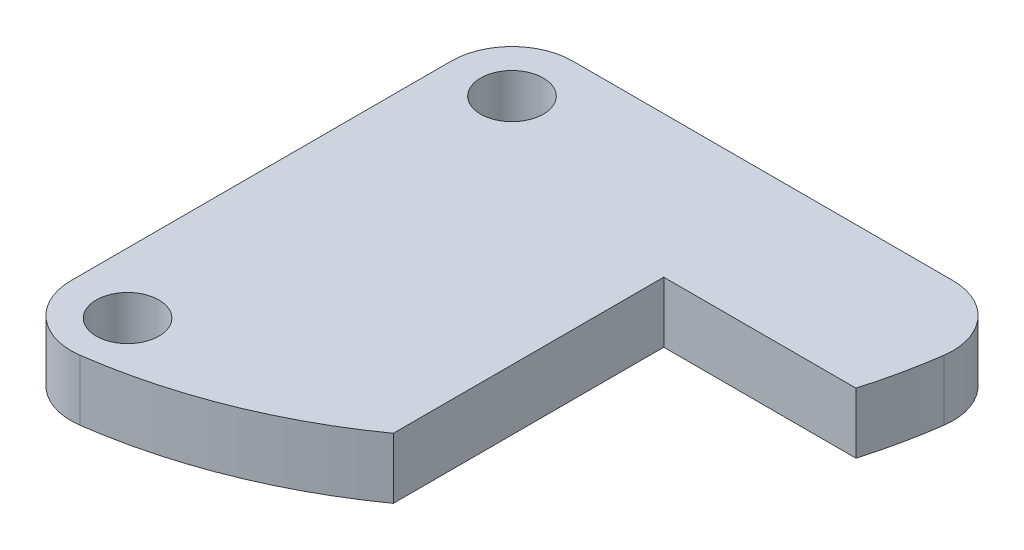
ISO-10303-21;
HEADER;
FILE_DESCRIPTION(('STEP AP214'),'2;1');
FILE_NAME('part.step','',(''),(''),'','','');
FILE_SCHEMA(('AUTOMOTIVE_DESIGN { 1 0 10303 214 1 1 1 1 }'));
ENDSEC;
DATA;
#1=APPLICATION_CONTEXT('core data for automotive mechanical design processes');
#2=APPLICATION_PROTOCOL_DEFINITION('international standard','automotive_design',2000,#1);
#3=PRODUCT_CONTEXT('',#1,'mechanical');
#4=PRODUCT('Part','Part','',(#3));
#5=PRODUCT_RELATED_PRODUCT_CATEGORY('part','',(#4));
#6=PRODUCT_DEFINITION_FORMATION('','',#4);
#7=PRODUCT_DEFINITION_CONTEXT('part definition',#1,'design');
#8=PRODUCT_DEFINITION('design','',#6,#7);
#9=PRODUCT_DEFINITION_SHAPE('','',#8);
#10=(LENGTH_UNIT() NAMED_UNIT(*) SI_UNIT(.MILLI.,.METRE.));
#11=(NAMED_UNIT(*) PLANE_ANGLE_UNIT() SI_UNIT($,.RADIAN.));
#12=(NAMED_UNIT(*) SI_UNIT($,.STERADIAN.) SOLID_ANGLE_UNIT());
#13=UNCERTAINTY_MEASURE_WITH_UNIT(LENGTH_MEASURE(1.E-05),#10,'distance_accuracy_value','');
#14=(GEOMETRIC_REPRESENTATION_CONTEXT(3) GLOBAL_UNCERTAINTY_ASSIGNED_CONTEXT((#13)) GLOBAL_UNIT_ASSIGNED_CONTEXT((#10,
#11,#12)) REPRESENTATION_CONTEXT('',''));
#15=CARTESIAN_POINT('',(0.,0.,0.));
#16=DIRECTION('',(0.,0.,1.));
#17=DIRECTION('',(1.,0.,0.));
#18=AXIS2_PLACEMENT_3D('',#15,#16,#17);
#19=CARTESIAN_POINT('',(-12.5,-3.,12.5));
#20=DIRECTION('',(-1.,0.,0.));
#21=DIRECTION('',(0.,0.,1.));
#22=AXIS2_PLACEMENT_3D('',#19,#20,#21);
#23=PLANE('',#22);
#24=DIRECTION('',(0.,0.,1.));
#25=VECTOR('',#24,1.);
#26=CARTESIAN_POINT('',(-12.5,0.,12.5));
#27=LINE('',#26,#25);
#28=CARTESIAN_POINT('',(-12.5,0.,-9.49999999999999));
#29=VERTEX_POINT('',#28);
#30=CARTESIAN_POINT('',(-12.5,0.,9.29449471770337));
#31=VERTEX_POINT('',#30);
#32=EDGE_CURVE('E153',#29,#31,#27,.T.);
#33=ORIENTED_EDGE('',*,*,#32,.F.);
#34=DIRECTION('',(0.,1.,0.));
#35=VECTOR('',#34,1.);
#36=CARTESIAN_POINT('',(-12.5,-3.,-9.5));
#37=LINE('',#36,#35);
#38=CARTESIAN_POINT('',(-12.5,-3.,-9.49999999999999));
#39=VERTEX_POINT('',#38);
#40=EDGE_CURVE('E174',#29,#39,#37,.F.);
#41=ORIENTED_EDGE('',*,*,#40,.T.);
#42=DIRECTION('',(0.,0.,1.));
#43=VECTOR('',#42,1.);
#44=CARTESIAN_POINT('',(-12.5,-3.,12.5));
#45=LINE('',#44,#43);
#46=CARTESIAN_POINT('',(-12.5,-3.,9.29449471770337));
#47=VERTEX_POINT('',#46);
#48=EDGE_CURVE('E152',#39,#47,#45,.T.);
#49=ORIENTED_EDGE('',*,*,#48,.T.);
#50=DIRECTION('',(0.,-1.,0.));
#51=VECTOR('',#50,1.);
#52=CARTESIAN_POINT('',(-12.5,0.,9.29449471770337));
#53=LINE('',#52,#51);
#54=EDGE_CURVE('E171',#47,#31,#53,.F.);
#55=ORIENTED_EDGE('',*,*,#54,.T.);
#56=EDGE_LOOP('',(#33,#41,#49,#55));
#57=FACE_BOUND('',#56,.T.);
#58=ADVANCED_FACE('F33',(#57),#23,.T.);
#59=CARTESIAN_POINT('',(-12.5,-3.,-12.5));
#60=DIRECTION('',(0.,0.,-1.));
#61=DIRECTION('',(-1.,0.,0.));
#62=AXIS2_PLACEMENT_3D('',#59,#60,#61);
#63=PLANE('',#62);
#64=DIRECTION('',(-1.,0.,0.));
#65=VECTOR('',#64,1.);
#66=CARTESIAN_POINT('',(-12.5,-3.,-12.5));
#67=LINE('',#66,#65);
#68=CARTESIAN_POINT('',(9.29449471770337,-3.,-12.5));
#69=VERTEX_POINT('',#68);
#70=CARTESIAN_POINT('',(-9.5,-3.,-12.5));
#71=VERTEX_POINT('',#70);
#72=EDGE_CURVE('E149',#69,#71,#67,.T.);
#73=ORIENTED_EDGE('',*,*,#72,.T.);
#74=DIRECTION('',(0.,1.,0.));
#75=VECTOR('',#74,1.);
#76=CARTESIAN_POINT('',(-9.5,-3.,-12.5));
#77=LINE('',#76,#75);
#78=CARTESIAN_POINT('',(-9.5,0.,-12.5));
#79=VERTEX_POINT('',#78);
#80=EDGE_CURVE('E163',#71,#79,#77,.T.);
#81=ORIENTED_EDGE('',*,*,#80,.T.);
#82=DIRECTION('',(-1.,0.,0.));
#83=VECTOR('',#82,1.);
#84=CARTESIAN_POINT('',(-12.5,0.,-12.5));
#85=LINE('',#84,#83);
#86=CARTESIAN_POINT('',(9.29449471770337,0.,-12.5));
#87=VERTEX_POINT('',#86);
#88=EDGE_CURVE('E146',#87,#79,#85,.T.);
#89=ORIENTED_EDGE('',*,*,#88,.F.);
#90=DIRECTION('',(0.,-1.,0.));
#91=VECTOR('',#90,1.);
#92=CARTESIAN_POINT('',(9.29449471770337,-3.,-12.5));
#93=LINE('',#92,#91);
#94=EDGE_CURVE('E161',#87,#69,#93,.T.);
#95=ORIENTED_EDGE('',*,*,#94,.T.);
#96=EDGE_LOOP('',(#73,#81,#89,#95));
#97=FACE_BOUND('',#96,.T.);
#98=ADVANCED_FACE('F207',(#97),#63,.T.);
#99=CARTESIAN_POINT('',(0.,-3.,0.));
#100=DIRECTION('',(0.,-1.,0.));
#101=DIRECTION('',(0.,0.,-1.));
#102=AXIS2_PLACEMENT_3D('',#99,#100,#101);
#103=PLANE('',#102);
#104=ORIENTED_EDGE('',*,*,#48,.F.);
#105=CARTESIAN_POINT('',(-9.5,-3.,-9.5));
#106=DIRECTION('',(0.,-1.,0.));
#107=DIRECTION('',(0.,0.,-1.));
#108=AXIS2_PLACEMENT_3D('',#105,#106,#107);
#109=CIRCLE('',#108,3.);
#110=EDGE_CURVE('E179',#39,#71,#109,.T.);
#111=ORIENTED_EDGE('',*,*,#110,.T.);
#112=ORIENTED_EDGE('',*,*,#72,.F.);
#113=CARTESIAN_POINT('',(9.29449471770337,-3.,-9.5));
#114=DIRECTION('',(0.,-1.,0.));
#115=DIRECTION('',(0.,0.,-1.));
#116=AXIS2_PLACEMENT_3D('',#113,#114,#115);
#117=CIRCLE('',#116,3.);
#118=CARTESIAN_POINT('',(12.2664712701175,-3.,-9.09090909090909));
#119=VERTEX_POINT('',#118);
#120=EDGE_CURVE('E48',#69,#119,#117,.T.);
#121=ORIENTED_EDGE('',*,*,#120,.T.);
#122=CARTESIAN_POINT('',(-12.5,-3.,-12.5));
#123=DIRECTION('',(0.,-1.,0.));
#124=DIRECTION('',(0.,0.,-1.));
#125=AXIS2_PLACEMENT_3D('',#122,#123,#124);
#126=CIRCLE('',#125,25.);
#127=CARTESIAN_POINT('',(11.5,-3.,-5.5));
#128=VERTEX_POINT('',#127);
#129=EDGE_CURVE('E112',#119,#128,#126,.T.);
#130=ORIENTED_EDGE('',*,*,#129,.T.);
#131=DIRECTION('',(-1.,0.,0.));
#132=VECTOR('',#131,1.);
#133=CARTESIAN_POINT('',(12.5,-3.,-5.5));
#134=LINE('',#133,#132);
#135=CARTESIAN_POINT('',(2.,-3.,-5.5));
#136=VERTEX_POINT('',#135);
#137=EDGE_CURVE('E128',#128,#136,#134,.T.);
#138=ORIENTED_EDGE('',*,*,#137,.T.);
#139=DIRECTION('',(0.,0.,1.));
#140=VECTOR('',#139,1.);
#141=CARTESIAN_POINT('',(2.,-3.,12.5));
#142=LINE('',#141,#140);
#143=CARTESIAN_POINT('',(2.,-3.,7.8654118544163));
#144=VERTEX_POINT('',#143);
#145=EDGE_CURVE('E130',#136,#144,#142,.T.);
#146=ORIENTED_EDGE('',*,*,#145,.T.);
#147=CARTESIAN_POINT('',(-9.09090909090909,-3.,12.2664712701175));
#148=VERTEX_POINT('',#147);
#149=EDGE_CURVE('E106',#144,#148,#126,.T.);
#150=ORIENTED_EDGE('',*,*,#149,.T.);
#151=CARTESIAN_POINT('',(-9.5,-3.,9.29449471770337));
#152=DIRECTION('',(0.,-1.,0.));
#153=DIRECTION('',(0.,0.,-1.));
#154=AXIS2_PLACEMENT_3D('',#151,#152,#153);
#155=CIRCLE('',#154,3.);
#156=EDGE_CURVE('E176',#148,#47,#155,.T.);
#157=ORIENTED_EDGE('',*,*,#156,.T.);
#158=EDGE_LOOP('',(#104,#111,#112,#121,#130,#138,#146,#150,#157));
#159=FACE_BOUND('',#158,.T.);
#160=CARTESIAN_POINT('',(-9.4999999999998,-3.,9.5));
#161=DIRECTION('',(0.,1.,0.));
#162=DIRECTION('',(0.,0.,1.));
#163=AXIS2_PLACEMENT_3D('',#160,#161,#162);
#164=CIRCLE('',#163,1.55);
#165=CARTESIAN_POINT('',(-9.4999999999998,-3.,11.05));
#166=VERTEX_POINT('',#165);
#167=EDGE_CURVE('E137',#166,#166,#164,.T.);
#168=ORIENTED_EDGE('',*,*,#167,.T.);
#169=EDGE_LOOP('',(#168));
#170=FACE_BOUND('',#169,.T.);
#171=CARTESIAN_POINT('',(-9.5,-3.,-9.5));
#172=DIRECTION('',(0.,1.,0.));
#173=DIRECTION('',(0.,0.,1.));
#174=AXIS2_PLACEMENT_3D('',#171,#172,#173);
#175=CIRCLE('',#174,1.55);
#176=CARTESIAN_POINT('',(-9.5,-3.,-7.95));
#177=VERTEX_POINT('',#176);
#178=EDGE_CURVE('E143',#177,#177,#175,.T.);
#179=ORIENTED_EDGE('',*,*,#178,.T.);
#180=EDGE_LOOP('',(#179));
#181=FACE_BOUND('',#180,.T.);
#182=ADVANCED_FACE('F190',(#159,#170,#181),#103,.T.);
#183=CARTESIAN_POINT('',(0.,0.,0.));
#184=DIRECTION('',(0.,-1.,0.));
#185=DIRECTION('',(0.,0.,-1.));
#186=AXIS2_PLACEMENT_3D('',#183,#184,#185);
#187=PLANE('',#186);
#188=CARTESIAN_POINT('',(-9.4999999999998,0.,9.5));
#189=DIRECTION('',(0.,1.,0.));
#190=DIRECTION('',(0.,0.,1.));
#191=AXIS2_PLACEMENT_3D('',#188,#189,#190);
#192=CIRCLE('',#191,1.55);
#193=CARTESIAN_POINT('',(-9.4999999999998,0.,11.05));
#194=VERTEX_POINT('',#193);
#195=EDGE_CURVE('E136',#194,#194,#192,.T.);
#196=ORIENTED_EDGE('',*,*,#195,.F.);
#197=EDGE_LOOP('',(#196));
#198=FACE_BOUND('',#197,.T.);
#199=CARTESIAN_POINT('',(-9.5,0.,-9.5));
#200=DIRECTION('',(0.,1.,0.));
#201=DIRECTION('',(0.,0.,1.));
#202=AXIS2_PLACEMENT_3D('',#199,#200,#201);
#203=CIRCLE('',#202,1.55);
#204=CARTESIAN_POINT('',(-9.5,0.,-7.95));
#205=VERTEX_POINT('',#204);
#206=EDGE_CURVE('E140',#205,#205,#203,.T.);
#207=ORIENTED_EDGE('',*,*,#206,.F.);
#208=EDGE_LOOP('',(#207));
#209=FACE_BOUND('',#208,.T.);
#210=ORIENTED_EDGE('',*,*,#88,.T.);
#211=CARTESIAN_POINT('',(-9.5,0.,-9.5));
#212=DIRECTION('',(0.,-1.,0.));
#213=DIRECTION('',(0.,0.,-1.));
#214=AXIS2_PLACEMENT_3D('',#211,#212,#213);
#215=CIRCLE('',#214,3.);
#216=EDGE_CURVE('E169',#79,#29,#215,.F.);
#217=ORIENTED_EDGE('',*,*,#216,.T.);
#218=ORIENTED_EDGE('',*,*,#32,.T.);
#219=CARTESIAN_POINT('',(-9.5,0.,9.29449471770337));
#220=DIRECTION('',(0.,-1.,0.));
#221=DIRECTION('',(0.,0.,-1.));
#222=AXIS2_PLACEMENT_3D('',#219,#220,#221);
#223=CIRCLE('',#222,3.);
#224=CARTESIAN_POINT('',(-9.09090909090909,0.,12.2664712701175));
#225=VERTEX_POINT('',#224);
#226=EDGE_CURVE('E121',#31,#225,#223,.F.);
#227=ORIENTED_EDGE('',*,*,#226,.T.);
#228=CARTESIAN_POINT('',(-12.5,0.,-12.5));
#229=DIRECTION('',(0.,-1.,0.));
#230=DIRECTION('',(0.,0.,-1.));
#231=AXIS2_PLACEMENT_3D('',#228,#229,#230);
#232=CIRCLE('',#231,25.);
#233=CARTESIAN_POINT('',(2.,0.,7.8654118544163));
#234=VERTEX_POINT('',#233);
#235=EDGE_CURVE('E105',#234,#225,#232,.T.);
#236=ORIENTED_EDGE('',*,*,#235,.F.);
#237=DIRECTION('',(0.,0.,1.));
#238=VECTOR('',#237,1.);
#239=CARTESIAN_POINT('',(2.,0.,12.5));
#240=LINE('',#239,#238);
#241=CARTESIAN_POINT('',(2.,0.,-5.5));
#242=VERTEX_POINT('',#241);
#243=EDGE_CURVE('E119',#242,#234,#240,.T.);
#244=ORIENTED_EDGE('',*,*,#243,.F.);
#245=DIRECTION('',(-1.,0.,0.));
#246=VECTOR('',#245,1.);
#247=CARTESIAN_POINT('',(12.5,0.,-5.5));
#248=LINE('',#247,#246);
#249=CARTESIAN_POINT('',(11.5,0.,-5.5));
#250=VERTEX_POINT('',#249);
#251=EDGE_CURVE('E111',#250,#242,#248,.T.);
#252=ORIENTED_EDGE('',*,*,#251,.F.);
#253=CARTESIAN_POINT('',(12.2664712701175,0.,-9.09090909090909));
#254=VERTEX_POINT('',#253);
#255=EDGE_CURVE('E122',#254,#250,#232,.T.);
#256=ORIENTED_EDGE('',*,*,#255,.F.);
#257=CARTESIAN_POINT('',(9.29449471770337,0.,-9.5));
#258=DIRECTION('',(0.,-1.,0.));
#259=DIRECTION('',(0.,0.,-1.));
#260=AXIS2_PLACEMENT_3D('',#257,#258,#259);
#261=CIRCLE('',#260,3.);
#262=EDGE_CURVE('E167',#254,#87,#261,.F.);
#263=ORIENTED_EDGE('',*,*,#262,.T.);
#264=EDGE_LOOP('',(#210,#217,#218,#227,#236,#244,#252,#256,#263));
#265=FACE_BOUND('',#264,.T.);
#266=ADVANCED_FACE('F117',(#198,#209,#265),#187,.F.);
#267=CARTESIAN_POINT('',(-9.5,-3.,-9.5));
#268=DIRECTION('',(0.,1.,0.));
#269=DIRECTION('',(0.,0.,1.));
#270=AXIS2_PLACEMENT_3D('',#267,#268,#269);
#271=CYLINDRICAL_SURFACE('',#270,1.55);
#272=ORIENTED_EDGE('',*,*,#178,.F.);
#273=EDGE_LOOP('',(#272));
#274=FACE_BOUND('',#273,.T.);
#275=ORIENTED_EDGE('',*,*,#206,.T.);
#276=EDGE_LOOP('',(#275));
#277=FACE_BOUND('',#276,.T.);
#278=ADVANCED_FACE('F267',(#274,#277),#271,.F.);
#279=CARTESIAN_POINT('',(-9.4999999999998,-3.,9.5));
#280=DIRECTION('',(0.,1.,0.));
#281=DIRECTION('',(0.,0.,1.));
#282=AXIS2_PLACEMENT_3D('',#279,#280,#281);
#283=CYLINDRICAL_SURFACE('',#282,1.55);
#284=ORIENTED_EDGE('',*,*,#167,.F.);
#285=EDGE_LOOP('',(#284));
#286=FACE_BOUND('',#285,.T.);
#287=ORIENTED_EDGE('',*,*,#195,.T.);
#288=EDGE_LOOP('',(#287));
#289=FACE_BOUND('',#288,.T.);
#290=ADVANCED_FACE('F204',(#286,#289),#283,.F.);
#291=CARTESIAN_POINT('',(2.,-3.,12.5));
#292=DIRECTION('',(-1.,0.,0.));
#293=DIRECTION('',(0.,0.,1.));
#294=AXIS2_PLACEMENT_3D('',#291,#292,#293);
#295=PLANE('',#294);
#296=ORIENTED_EDGE('',*,*,#243,.T.);
#297=DIRECTION('',(0.,1.,0.));
#298=VECTOR('',#297,1.);
#299=CARTESIAN_POINT('',(2.,-3.,7.8654118544163));
#300=LINE('',#299,#298);
#301=EDGE_CURVE('E102',#234,#144,#300,.F.);
#302=ORIENTED_EDGE('',*,*,#301,.T.);
#303=ORIENTED_EDGE('',*,*,#145,.F.);
#304=DIRECTION('',(0.,1.,0.));
#305=VECTOR('',#304,1.);
#306=CARTESIAN_POINT('',(2.,-3.,-5.5));
#307=LINE('',#306,#305);
#308=EDGE_CURVE('E127',#136,#242,#307,.T.);
#309=ORIENTED_EDGE('',*,*,#308,.T.);
#310=EDGE_LOOP('',(#296,#302,#303,#309));
#311=FACE_BOUND('',#310,.T.);
#312=ADVANCED_FACE('F125',(#311),#295,.F.);
#313=CARTESIAN_POINT('',(12.5,-3.,-5.5));
#314=DIRECTION('',(0.,0.,-1.));
#315=DIRECTION('',(-1.,0.,0.));
#316=AXIS2_PLACEMENT_3D('',#313,#314,#315);
#317=PLANE('',#316);
#318=ORIENTED_EDGE('',*,*,#137,.F.);
#319=DIRECTION('',(0.,1.,0.));
#320=VECTOR('',#319,1.);
#321=CARTESIAN_POINT('',(11.5,-3.,-5.5));
#322=LINE('',#321,#320);
#323=EDGE_CURVE('E156',#128,#250,#322,.T.);
#324=ORIENTED_EDGE('',*,*,#323,.T.);
#325=ORIENTED_EDGE('',*,*,#251,.T.);
#326=ORIENTED_EDGE('',*,*,#308,.F.);
#327=EDGE_LOOP('',(#318,#324,#325,#326));
#328=FACE_BOUND('',#327,.T.);
#329=ADVANCED_FACE('F195',(#328),#317,.F.);
#330=CARTESIAN_POINT('',(-12.5,-3.,-12.5));
#331=DIRECTION('',(0.,1.,0.));
#332=DIRECTION('',(0.,0.,1.));
#333=AXIS2_PLACEMENT_3D('',#330,#331,#332);
#334=CYLINDRICAL_SURFACE('',#333,25.);
#335=ORIENTED_EDGE('',*,*,#129,.F.);
#336=DIRECTION('',(0.,1.,0.));
#337=VECTOR('',#336,1.);
#338=CARTESIAN_POINT('',(12.2664712701175,-3.,-9.09090909090909));
#339=LINE('',#338,#337);
#340=EDGE_CURVE('E41',#119,#254,#339,.T.);
#341=ORIENTED_EDGE('',*,*,#340,.T.);
#342=ORIENTED_EDGE('',*,*,#255,.T.);
#343=ORIENTED_EDGE('',*,*,#323,.F.);
#344=EDGE_LOOP('',(#335,#341,#342,#343));
#345=FACE_BOUND('',#344,.T.);
#346=ADVANCED_FACE('F184',(#345),#334,.T.);
#347=ORIENTED_EDGE('',*,*,#235,.T.);
#348=DIRECTION('',(0.,1.,0.));
#349=VECTOR('',#348,1.);
#350=CARTESIAN_POINT('',(-9.09090909090909,-3.,12.2664712701175));
#351=LINE('',#350,#349);
#352=EDGE_CURVE('E11',#225,#148,#351,.F.);
#353=ORIENTED_EDGE('',*,*,#352,.T.);
#354=ORIENTED_EDGE('',*,*,#149,.F.);
#355=ORIENTED_EDGE('',*,*,#301,.F.);
#356=EDGE_LOOP('',(#347,#353,#354,#355));
#357=FACE_BOUND('',#356,.T.);
#358=ADVANCED_FACE('F104',(#357),#334,.T.);
#359=CARTESIAN_POINT('',(-9.5,-3.,-9.5));
#360=DIRECTION('',(0.,1.,0.));
#361=DIRECTION('',(0.,0.,1.));
#362=AXIS2_PLACEMENT_3D('',#359,#360,#361);
#363=CYLINDRICAL_SURFACE('',#362,3.);
#364=ORIENTED_EDGE('',*,*,#110,.F.);
#365=ORIENTED_EDGE('',*,*,#40,.F.);
#366=ORIENTED_EDGE('',*,*,#216,.F.);
#367=ORIENTED_EDGE('',*,*,#80,.F.);
#368=EDGE_LOOP('',(#364,#365,#366,#367));
#369=FACE_BOUND('',#368,.T.);
#370=ADVANCED_FACE('F219',(#369),#363,.T.);
#371=CARTESIAN_POINT('',(9.29449471770337,-3.,-9.5));
#372=DIRECTION('',(0.,1.,0.));
#373=DIRECTION('',(0.,0.,1.));
#374=AXIS2_PLACEMENT_3D('',#371,#372,#373);
#375=CYLINDRICAL_SURFACE('',#374,3.);
#376=ORIENTED_EDGE('',*,*,#120,.F.);
#377=ORIENTED_EDGE('',*,*,#94,.F.);
#378=ORIENTED_EDGE('',*,*,#262,.F.);
#379=ORIENTED_EDGE('',*,*,#340,.F.);
#380=EDGE_LOOP('',(#376,#377,#378,#379));
#381=FACE_BOUND('',#380,.T.);
#382=ADVANCED_FACE('F221',(#381),#375,.T.);
#383=CARTESIAN_POINT('',(-9.5,-3.,9.29449471770337));
#384=DIRECTION('',(0.,1.,0.));
#385=DIRECTION('',(0.,0.,1.));
#386=AXIS2_PLACEMENT_3D('',#383,#384,#385);
#387=CYLINDRICAL_SURFACE('',#386,3.);
#388=ORIENTED_EDGE('',*,*,#156,.F.);
#389=ORIENTED_EDGE('',*,*,#352,.F.);
#390=ORIENTED_EDGE('',*,*,#226,.F.);
#391=ORIENTED_EDGE('',*,*,#54,.F.);
#392=EDGE_LOOP('',(#388,#389,#390,#391));
#393=FACE_BOUND('',#392,.T.);
#394=ADVANCED_FACE('F35',(#393),#387,.T.);
#395=CLOSED_SHELL('',(#58,#98,#182,#266,#278,#290,#312,#329,#346,#358,#370,#382,#394));
#396=MANIFOLD_SOLID_BREP('B2',#395);
#397=ADVANCED_BREP_SHAPE_REPRESENTATION('',(#18,#396),#14);
#398=SHAPE_DEFINITION_REPRESENTATION(#9,#397);
ENDSEC;
END-ISO-10303-21;
